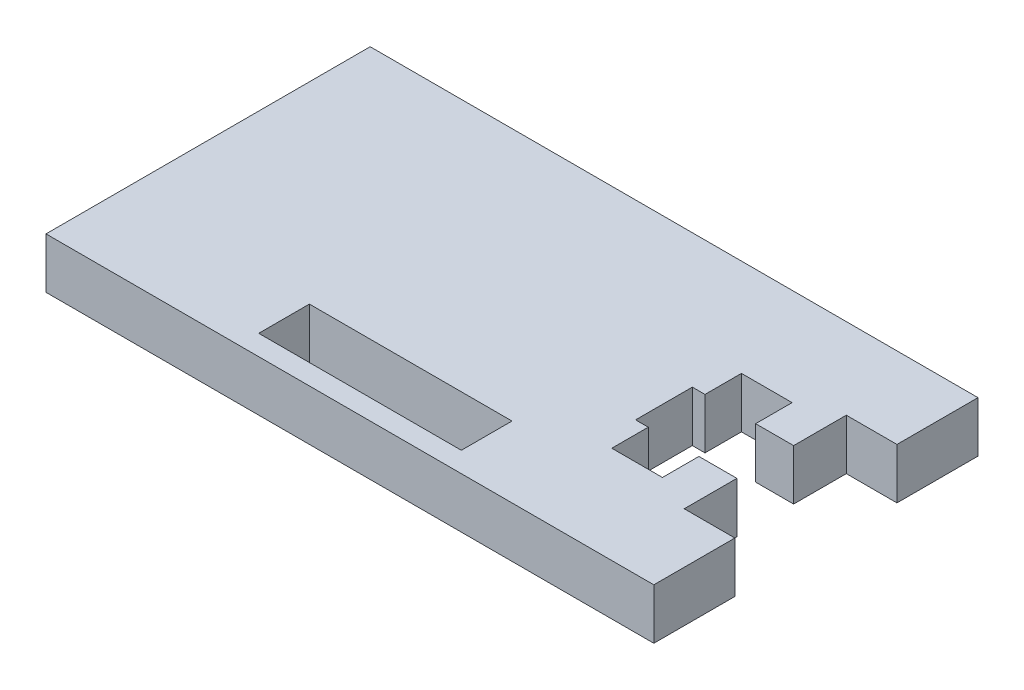
ISO-10303-21;
HEADER;
FILE_DESCRIPTION(('STEP AP214'),'2;1');
FILE_NAME('part.step','',(''),(''),'','','');
FILE_SCHEMA(('AUTOMOTIVE_DESIGN { 1 0 10303 214 1 1 1 1 }'));
ENDSEC;
DATA;
#1=APPLICATION_CONTEXT('core data for automotive mechanical design processes');
#2=APPLICATION_PROTOCOL_DEFINITION('international standard','automotive_design',2000,#1);
#3=PRODUCT_CONTEXT('',#1,'mechanical');
#4=PRODUCT('Part','Part','',(#3));
#5=PRODUCT_RELATED_PRODUCT_CATEGORY('part','',(#4));
#6=PRODUCT_DEFINITION_FORMATION('','',#4);
#7=PRODUCT_DEFINITION_CONTEXT('part definition',#1,'design');
#8=PRODUCT_DEFINITION('design','',#6,#7);
#9=PRODUCT_DEFINITION_SHAPE('','',#8);
#10=(LENGTH_UNIT() NAMED_UNIT(*) SI_UNIT(.MILLI.,.METRE.));
#11=(NAMED_UNIT(*) PLANE_ANGLE_UNIT() SI_UNIT($,.RADIAN.));
#12=(NAMED_UNIT(*) SI_UNIT($,.STERADIAN.) SOLID_ANGLE_UNIT());
#13=UNCERTAINTY_MEASURE_WITH_UNIT(LENGTH_MEASURE(1.E-05),#10,'distance_accuracy_value','');
#14=(GEOMETRIC_REPRESENTATION_CONTEXT(3) GLOBAL_UNCERTAINTY_ASSIGNED_CONTEXT((#13)) GLOBAL_UNIT_ASSIGNED_CONTEXT((#10,
#11,#12)) REPRESENTATION_CONTEXT('',''));
#15=CARTESIAN_POINT('',(0.,0.,0.));
#16=DIRECTION('',(0.,0.,1.));
#17=DIRECTION('',(1.,0.,0.));
#18=AXIS2_PLACEMENT_3D('',#15,#16,#17);
#19=CARTESIAN_POINT('',(0.,0.,8.38200000000001));
#20=DIRECTION('',(0.,0.,-1.));
#21=DIRECTION('',(-1.,0.,0.));
#22=AXIS2_PLACEMENT_3D('',#19,#20,#21);
#23=PLANE('',#22);
#24=DIRECTION('',(-1.,0.,0.));
#25=VECTOR('',#24,1.);
#26=CARTESIAN_POINT('',(0.,0.,8.38200000000001));
#27=LINE('',#26,#25);
#28=CARTESIAN_POINT('',(29.36875,0.,8.382));
#29=VERTEX_POINT('',#28);
#30=CARTESIAN_POINT('',(28.575,0.,8.382));
#31=VERTEX_POINT('',#30);
#32=EDGE_CURVE('E280',#29,#31,#27,.T.);
#33=ORIENTED_EDGE('',*,*,#32,.F.);
#34=DIRECTION('',(0.,1.,0.));
#35=VECTOR('',#34,1.);
#36=CARTESIAN_POINT('',(29.36875,0.,8.382));
#37=LINE('',#36,#35);
#38=CARTESIAN_POINT('',(29.36875,3.175,8.382));
#39=VERTEX_POINT('',#38);
#40=EDGE_CURVE('E272',#29,#39,#37,.T.);
#41=ORIENTED_EDGE('',*,*,#40,.T.);
#42=DIRECTION('',(-1.,0.,0.));
#43=VECTOR('',#42,1.);
#44=CARTESIAN_POINT('',(0.,3.175,8.38200000000001));
#45=LINE('',#44,#43);
#46=CARTESIAN_POINT('',(28.575,3.175,8.382));
#47=VERTEX_POINT('',#46);
#48=EDGE_CURVE('E275',#39,#47,#45,.T.);
#49=ORIENTED_EDGE('',*,*,#48,.T.);
#50=DIRECTION('',(0.,1.,0.));
#51=VECTOR('',#50,1.);
#52=CARTESIAN_POINT('',(28.575,0.,8.382));
#53=LINE('',#52,#51);
#54=EDGE_CURVE('E333',#31,#47,#53,.T.);
#55=ORIENTED_EDGE('',*,*,#54,.F.);
#56=EDGE_LOOP('',(#33,#41,#49,#55));
#57=FACE_BOUND('',#56,.T.);
#58=ADVANCED_FACE('F37',(#57),#23,.F.);
#59=CARTESIAN_POINT('',(0.,0.,11.938));
#60=DIRECTION('',(0.,0.,-1.));
#61=DIRECTION('',(-1.,0.,0.));
#62=AXIS2_PLACEMENT_3D('',#59,#60,#61);
#63=PLANE('',#62);
#64=DIRECTION('',(0.,1.,0.));
#65=VECTOR('',#64,1.);
#66=CARTESIAN_POINT('',(29.36875,0.,11.938));
#67=LINE('',#66,#65);
#68=CARTESIAN_POINT('',(29.36875,0.,11.938));
#69=VERTEX_POINT('',#68);
#70=CARTESIAN_POINT('',(29.36875,3.175,11.938));
#71=VERTEX_POINT('',#70);
#72=EDGE_CURVE('E11',#69,#71,#67,.T.);
#73=ORIENTED_EDGE('',*,*,#72,.F.);
#74=DIRECTION('',(-1.,0.,0.));
#75=VECTOR('',#74,1.);
#76=CARTESIAN_POINT('',(0.,0.,11.938));
#77=LINE('',#76,#75);
#78=CARTESIAN_POINT('',(28.575,0.,11.938));
#79=VERTEX_POINT('',#78);
#80=EDGE_CURVE('E283',#69,#79,#77,.T.);
#81=ORIENTED_EDGE('',*,*,#80,.T.);
#82=DIRECTION('',(0.,1.,0.));
#83=VECTOR('',#82,1.);
#84=CARTESIAN_POINT('',(28.575,0.,11.938));
#85=LINE('',#84,#83);
#86=CARTESIAN_POINT('',(28.575,3.175,11.938));
#87=VERTEX_POINT('',#86);
#88=EDGE_CURVE('E330',#79,#87,#85,.T.);
#89=ORIENTED_EDGE('',*,*,#88,.T.);
#90=DIRECTION('',(-1.,0.,0.));
#91=VECTOR('',#90,1.);
#92=CARTESIAN_POINT('',(0.,3.175,11.938));
#93=LINE('',#92,#91);
#94=EDGE_CURVE('E302',#71,#87,#93,.T.);
#95=ORIENTED_EDGE('',*,*,#94,.F.);
#96=EDGE_LOOP('',(#73,#81,#89,#95));
#97=FACE_BOUND('',#96,.T.);
#98=ADVANCED_FACE('F445',(#97),#63,.T.);
#99=CARTESIAN_POINT('',(38.1,3.175,0.));
#100=DIRECTION('',(-1.,0.,0.));
#101=DIRECTION('',(0.,0.,1.));
#102=AXIS2_PLACEMENT_3D('',#99,#100,#101);
#103=PLANE('',#102);
#104=DIRECTION('',(0.,1.,0.));
#105=VECTOR('',#104,1.);
#106=CARTESIAN_POINT('',(38.1,0.,15.24));
#107=LINE('',#106,#105);
#108=CARTESIAN_POINT('',(38.1,0.,15.24));
#109=VERTEX_POINT('',#108);
#110=CARTESIAN_POINT('',(38.1,3.175,15.24));
#111=VERTEX_POINT('',#110);
#112=EDGE_CURVE('E323',#109,#111,#107,.T.);
#113=ORIENTED_EDGE('',*,*,#112,.T.);
#114=DIRECTION('',(0.,0.,-1.));
#115=VECTOR('',#114,1.);
#116=CARTESIAN_POINT('',(38.1,3.175,0.));
#117=LINE('',#116,#115);
#118=CARTESIAN_POINT('',(38.1,3.175,20.32));
#119=VERTEX_POINT('',#118);
#120=EDGE_CURVE('E343',#119,#111,#117,.T.);
#121=ORIENTED_EDGE('',*,*,#120,.F.);
#122=DIRECTION('',(0.,-1.,0.));
#123=VECTOR('',#122,1.);
#124=CARTESIAN_POINT('',(38.1,3.175,20.32));
#125=LINE('',#124,#123);
#126=CARTESIAN_POINT('',(38.1,0.,20.32));
#127=VERTEX_POINT('',#126);
#128=EDGE_CURVE('E363',#119,#127,#125,.T.);
#129=ORIENTED_EDGE('',*,*,#128,.T.);
#130=DIRECTION('',(0.,0.,-1.));
#131=VECTOR('',#130,1.);
#132=CARTESIAN_POINT('',(38.1,0.,0.));
#133=LINE('',#132,#131);
#134=EDGE_CURVE('E354',#127,#109,#133,.T.);
#135=ORIENTED_EDGE('',*,*,#134,.T.);
#136=EDGE_LOOP('',(#113,#121,#129,#135));
#137=FACE_BOUND('',#136,.T.);
#138=ADVANCED_FACE('F388',(#137),#103,.F.);
#139=CARTESIAN_POINT('',(0.,3.175,0.));
#140=DIRECTION('',(1.,0.,0.));
#141=DIRECTION('',(0.,0.,-1.));
#142=AXIS2_PLACEMENT_3D('',#139,#140,#141);
#143=PLANE('',#142);
#144=DIRECTION('',(0.,0.,1.));
#145=VECTOR('',#144,1.);
#146=CARTESIAN_POINT('',(0.,0.,0.));
#147=LINE('',#146,#145);
#148=CARTESIAN_POINT('',(0.,0.,0.));
#149=VERTEX_POINT('',#148);
#150=CARTESIAN_POINT('',(0.,0.,20.32));
#151=VERTEX_POINT('',#150);
#152=EDGE_CURVE('E318',#149,#151,#147,.T.);
#153=ORIENTED_EDGE('',*,*,#152,.T.);
#154=DIRECTION('',(0.,-1.,0.));
#155=VECTOR('',#154,1.);
#156=CARTESIAN_POINT('',(0.,3.175,20.32));
#157=LINE('',#156,#155);
#158=CARTESIAN_POINT('',(0.,3.175,20.32));
#159=VERTEX_POINT('',#158);
#160=EDGE_CURVE('E366',#159,#151,#157,.T.);
#161=ORIENTED_EDGE('',*,*,#160,.F.);
#162=DIRECTION('',(0.,0.,1.));
#163=VECTOR('',#162,1.);
#164=CARTESIAN_POINT('',(0.,3.175,0.));
#165=LINE('',#164,#163);
#166=CARTESIAN_POINT('',(0.,3.175,0.));
#167=VERTEX_POINT('',#166);
#168=EDGE_CURVE('E336',#167,#159,#165,.T.);
#169=ORIENTED_EDGE('',*,*,#168,.F.);
#170=DIRECTION('',(0.,-1.,0.));
#171=VECTOR('',#170,1.);
#172=CARTESIAN_POINT('',(0.,3.175,0.));
#173=LINE('',#172,#171);
#174=EDGE_CURVE('E348',#167,#149,#173,.T.);
#175=ORIENTED_EDGE('',*,*,#174,.T.);
#176=EDGE_LOOP('',(#153,#161,#169,#175));
#177=FACE_BOUND('',#176,.T.);
#178=ADVANCED_FACE('F39',(#177),#143,.F.);
#179=CARTESIAN_POINT('',(0.,3.175,20.32));
#180=DIRECTION('',(0.,0.,-1.));
#181=DIRECTION('',(-1.,0.,0.));
#182=AXIS2_PLACEMENT_3D('',#179,#180,#181);
#183=PLANE('',#182);
#184=DIRECTION('',(1.,0.,0.));
#185=VECTOR('',#184,1.);
#186=CARTESIAN_POINT('',(0.,0.,20.32));
#187=LINE('',#186,#185);
#188=EDGE_CURVE('E351',#151,#127,#187,.T.);
#189=ORIENTED_EDGE('',*,*,#188,.T.);
#190=ORIENTED_EDGE('',*,*,#128,.F.);
#191=DIRECTION('',(1.,0.,0.));
#192=VECTOR('',#191,1.);
#193=CARTESIAN_POINT('',(0.,3.175,20.32));
#194=LINE('',#193,#192);
#195=EDGE_CURVE('E339',#159,#119,#194,.T.);
#196=ORIENTED_EDGE('',*,*,#195,.F.);
#197=ORIENTED_EDGE('',*,*,#160,.T.);
#198=EDGE_LOOP('',(#189,#190,#196,#197));
#199=FACE_BOUND('',#198,.T.);
#200=ADVANCED_FACE('F392',(#199),#183,.F.);
#201=CARTESIAN_POINT('',(38.1,3.175,5.08));
#202=VERTEX_POINT('',#201);
#203=CARTESIAN_POINT('',(38.1,3.175,0.));
#204=VERTEX_POINT('',#203);
#205=EDGE_CURVE('E342',#202,#204,#117,.T.);
#206=ORIENTED_EDGE('',*,*,#205,.F.);
#207=DIRECTION('',(0.,1.,0.));
#208=VECTOR('',#207,1.);
#209=CARTESIAN_POINT('',(38.1,0.,5.08));
#210=LINE('',#209,#208);
#211=CARTESIAN_POINT('',(38.1,0.,5.08));
#212=VERTEX_POINT('',#211);
#213=EDGE_CURVE('E321',#212,#202,#210,.T.);
#214=ORIENTED_EDGE('',*,*,#213,.F.);
#215=CARTESIAN_POINT('',(38.1,0.,0.));
#216=VERTEX_POINT('',#215);
#217=EDGE_CURVE('E353',#212,#216,#133,.T.);
#218=ORIENTED_EDGE('',*,*,#217,.T.);
#219=DIRECTION('',(0.,-1.,0.));
#220=VECTOR('',#219,1.);
#221=CARTESIAN_POINT('',(38.1,3.175,0.));
#222=LINE('',#221,#220);
#223=EDGE_CURVE('E360',#204,#216,#222,.T.);
#224=ORIENTED_EDGE('',*,*,#223,.F.);
#225=EDGE_LOOP('',(#206,#214,#218,#224));
#226=FACE_BOUND('',#225,.T.);
#227=ADVANCED_FACE('F406',(#226),#103,.F.);
#228=CARTESIAN_POINT('',(0.,3.175,0.));
#229=DIRECTION('',(0.,0.,1.));
#230=DIRECTION('',(1.,0.,0.));
#231=AXIS2_PLACEMENT_3D('',#228,#229,#230);
#232=PLANE('',#231);
#233=DIRECTION('',(-1.,0.,0.));
#234=VECTOR('',#233,1.);
#235=CARTESIAN_POINT('',(0.,0.,0.));
#236=LINE('',#235,#234);
#237=EDGE_CURVE('E340',#216,#149,#236,.T.);
#238=ORIENTED_EDGE('',*,*,#237,.T.);
#239=ORIENTED_EDGE('',*,*,#174,.F.);
#240=DIRECTION('',(-1.,0.,0.));
#241=VECTOR('',#240,1.);
#242=CARTESIAN_POINT('',(0.,3.175,0.));
#243=LINE('',#242,#241);
#244=EDGE_CURVE('E346',#204,#167,#243,.T.);
#245=ORIENTED_EDGE('',*,*,#244,.F.);
#246=ORIENTED_EDGE('',*,*,#223,.T.);
#247=EDGE_LOOP('',(#238,#239,#245,#246));
#248=FACE_BOUND('',#247,.T.);
#249=ADVANCED_FACE('F402',(#248),#232,.F.);
#250=CARTESIAN_POINT('',(0.,3.175,0.));
#251=DIRECTION('',(0.,1.,0.));
#252=DIRECTION('',(0.,0.,1.));
#253=AXIS2_PLACEMENT_3D('',#250,#251,#252);
#254=PLANE('',#253);
#255=DIRECTION('',(0.,0.,1.));
#256=VECTOR('',#255,1.);
#257=CARTESIAN_POINT('',(12.065,3.175,15.875));
#258=LINE('',#257,#256);
#259=CARTESIAN_POINT('',(12.065,3.175,15.875));
#260=VERTEX_POINT('',#259);
#261=CARTESIAN_POINT('',(12.065,3.175,19.05));
#262=VERTEX_POINT('',#261);
#263=EDGE_CURVE('E52',#260,#262,#258,.T.);
#264=ORIENTED_EDGE('',*,*,#263,.F.);
#265=DIRECTION('',(-1.,0.,0.));
#266=VECTOR('',#265,1.);
#267=CARTESIAN_POINT('',(12.065,3.175,15.875));
#268=LINE('',#267,#266);
#269=CARTESIAN_POINT('',(24.765,3.175,15.875));
#270=VERTEX_POINT('',#269);
#271=EDGE_CURVE('E215',#270,#260,#268,.T.);
#272=ORIENTED_EDGE('',*,*,#271,.F.);
#273=DIRECTION('',(0.,0.,-1.));
#274=VECTOR('',#273,1.);
#275=CARTESIAN_POINT('',(24.765,3.175,15.875));
#276=LINE('',#275,#274);
#277=CARTESIAN_POINT('',(24.765,3.175,19.05));
#278=VERTEX_POINT('',#277);
#279=EDGE_CURVE('E218',#278,#270,#276,.T.);
#280=ORIENTED_EDGE('',*,*,#279,.F.);
#281=DIRECTION('',(1.,0.,0.));
#282=VECTOR('',#281,1.);
#283=CARTESIAN_POINT('',(12.065,3.175,19.05));
#284=LINE('',#283,#282);
#285=EDGE_CURVE('E224',#262,#278,#284,.T.);
#286=ORIENTED_EDGE('',*,*,#285,.F.);
#287=EDGE_LOOP('',(#264,#272,#280,#286));
#288=FACE_BOUND('',#287,.T.);
#289=DIRECTION('',(0.,0.,1.));
#290=VECTOR('',#289,1.);
#291=CARTESIAN_POINT('',(29.36875,3.175,14.224));
#292=LINE('',#291,#290);
#293=CARTESIAN_POINT('',(29.36875,3.175,6.096));
#294=VERTEX_POINT('',#293);
#295=EDGE_CURVE('E249',#294,#39,#292,.T.);
#296=ORIENTED_EDGE('',*,*,#295,.F.);
#297=DIRECTION('',(-1.,0.,0.));
#298=VECTOR('',#297,1.);
#299=CARTESIAN_POINT('',(29.36875,3.175,6.096));
#300=LINE('',#299,#298);
#301=CARTESIAN_POINT('',(32.54375,3.175,6.096));
#302=VERTEX_POINT('',#301);
#303=EDGE_CURVE('E257',#302,#294,#300,.T.);
#304=ORIENTED_EDGE('',*,*,#303,.F.);
#305=DIRECTION('',(0.,0.,-1.));
#306=VECTOR('',#305,1.);
#307=CARTESIAN_POINT('',(32.54375,3.175,14.224));
#308=LINE('',#307,#306);
#309=CARTESIAN_POINT('',(32.54375,3.175,8.382));
#310=VERTEX_POINT('',#309);
#311=EDGE_CURVE('E254',#310,#302,#308,.T.);
#312=ORIENTED_EDGE('',*,*,#311,.F.);
#313=CARTESIAN_POINT('',(34.925,3.175,8.382));
#314=VERTEX_POINT('',#313);
#315=EDGE_CURVE('E296',#314,#310,#45,.T.);
#316=ORIENTED_EDGE('',*,*,#315,.F.);
#317=DIRECTION('',(0.,0.,1.));
#318=VECTOR('',#317,1.);
#319=CARTESIAN_POINT('',(34.925,3.175,0.));
#320=LINE('',#319,#318);
#321=CARTESIAN_POINT('',(34.925,3.175,5.08));
#322=VERTEX_POINT('',#321);
#323=EDGE_CURVE('E310',#322,#314,#320,.T.);
#324=ORIENTED_EDGE('',*,*,#323,.F.);
#325=DIRECTION('',(-1.,0.,0.));
#326=VECTOR('',#325,1.);
#327=CARTESIAN_POINT('',(0.,3.175,5.07999999999998));
#328=LINE('',#327,#326);
#329=EDGE_CURVE('E313',#202,#322,#328,.T.);
#330=ORIENTED_EDGE('',*,*,#329,.F.);
#331=ORIENTED_EDGE('',*,*,#205,.T.);
#332=ORIENTED_EDGE('',*,*,#244,.T.);
#333=ORIENTED_EDGE('',*,*,#168,.T.);
#334=ORIENTED_EDGE('',*,*,#195,.T.);
#335=ORIENTED_EDGE('',*,*,#120,.T.);
#336=DIRECTION('',(-1.,0.,0.));
#337=VECTOR('',#336,1.);
#338=CARTESIAN_POINT('',(0.,3.175,15.24));
#339=LINE('',#338,#337);
#340=CARTESIAN_POINT('',(34.925,3.175,15.24));
#341=VERTEX_POINT('',#340);
#342=EDGE_CURVE('E309',#111,#341,#339,.T.);
#343=ORIENTED_EDGE('',*,*,#342,.T.);
#344=CARTESIAN_POINT('',(34.925,3.175,11.938));
#345=VERTEX_POINT('',#344);
#346=EDGE_CURVE('E306',#345,#341,#320,.T.);
#347=ORIENTED_EDGE('',*,*,#346,.F.);
#348=CARTESIAN_POINT('',(32.54375,3.175,11.938));
#349=VERTEX_POINT('',#348);
#350=EDGE_CURVE('E303',#345,#349,#93,.T.);
#351=ORIENTED_EDGE('',*,*,#350,.T.);
#352=CARTESIAN_POINT('',(32.54375,3.175,14.224));
#353=VERTEX_POINT('',#352);
#354=EDGE_CURVE('E255',#353,#349,#308,.T.);
#355=ORIENTED_EDGE('',*,*,#354,.F.);
#356=DIRECTION('',(1.,0.,0.));
#357=VECTOR('',#356,1.);
#358=CARTESIAN_POINT('',(29.36875,3.175,14.224));
#359=LINE('',#358,#357);
#360=CARTESIAN_POINT('',(29.36875,3.175,14.224));
#361=VERTEX_POINT('',#360);
#362=EDGE_CURVE('E251',#361,#353,#359,.T.);
#363=ORIENTED_EDGE('',*,*,#362,.F.);
#364=EDGE_CURVE('E230',#71,#361,#292,.T.);
#365=ORIENTED_EDGE('',*,*,#364,.F.);
#366=ORIENTED_EDGE('',*,*,#94,.T.);
#367=DIRECTION('',(0.,0.,1.));
#368=VECTOR('',#367,1.);
#369=CARTESIAN_POINT('',(28.575,3.175,0.));
#370=LINE('',#369,#368);
#371=EDGE_CURVE('E299',#47,#87,#370,.T.);
#372=ORIENTED_EDGE('',*,*,#371,.F.);
#373=ORIENTED_EDGE('',*,*,#48,.F.);
#374=EDGE_LOOP('',(#296,#304,#312,#316,#324,#330,#331,#332,#333,#334,#335,#343,#347,#351,#355,
#363,#365,#366,#372,#373));
#375=FACE_BOUND('',#374,.T.);
#376=ADVANCED_FACE('F452',(#288,#375),#254,.T.);
#377=CARTESIAN_POINT('',(0.,0.,0.));
#378=DIRECTION('',(0.,1.,0.));
#379=DIRECTION('',(0.,0.,1.));
#380=AXIS2_PLACEMENT_3D('',#377,#378,#379);
#381=PLANE('',#380);
#382=DIRECTION('',(-1.,0.,0.));
#383=VECTOR('',#382,1.);
#384=CARTESIAN_POINT('',(12.065,0.,15.875));
#385=LINE('',#384,#383);
#386=CARTESIAN_POINT('',(24.765,0.,15.875));
#387=VERTEX_POINT('',#386);
#388=CARTESIAN_POINT('',(12.065,0.,15.875));
#389=VERTEX_POINT('',#388);
#390=EDGE_CURVE('E205',#387,#389,#385,.T.);
#391=ORIENTED_EDGE('',*,*,#390,.T.);
#392=DIRECTION('',(0.,0.,1.));
#393=VECTOR('',#392,1.);
#394=CARTESIAN_POINT('',(12.065,0.,15.875));
#395=LINE('',#394,#393);
#396=CARTESIAN_POINT('',(12.065,0.,19.05));
#397=VERTEX_POINT('',#396);
#398=EDGE_CURVE('E199',#389,#397,#395,.T.);
#399=ORIENTED_EDGE('',*,*,#398,.T.);
#400=DIRECTION('',(1.,0.,0.));
#401=VECTOR('',#400,1.);
#402=CARTESIAN_POINT('',(12.065,0.,19.05));
#403=LINE('',#402,#401);
#404=CARTESIAN_POINT('',(24.765,0.,19.05));
#405=VERTEX_POINT('',#404);
#406=EDGE_CURVE('E208',#397,#405,#403,.T.);
#407=ORIENTED_EDGE('',*,*,#406,.T.);
#408=DIRECTION('',(0.,0.,-1.));
#409=VECTOR('',#408,1.);
#410=CARTESIAN_POINT('',(24.765,0.,15.875));
#411=LINE('',#410,#409);
#412=EDGE_CURVE('E60',#405,#387,#411,.T.);
#413=ORIENTED_EDGE('',*,*,#412,.T.);
#414=EDGE_LOOP('',(#391,#399,#407,#413));
#415=FACE_BOUND('',#414,.T.);
#416=DIRECTION('',(-1.,0.,0.));
#417=VECTOR('',#416,1.);
#418=CARTESIAN_POINT('',(29.36875,0.,6.096));
#419=LINE('',#418,#417);
#420=CARTESIAN_POINT('',(32.54375,0.,6.096));
#421=VERTEX_POINT('',#420);
#422=CARTESIAN_POINT('',(29.36875,0.,6.096));
#423=VERTEX_POINT('',#422);
#424=EDGE_CURVE('E245',#421,#423,#419,.T.);
#425=ORIENTED_EDGE('',*,*,#424,.T.);
#426=DIRECTION('',(0.,0.,1.));
#427=VECTOR('',#426,1.);
#428=CARTESIAN_POINT('',(29.36875,0.,14.224));
#429=LINE('',#428,#427);
#430=EDGE_CURVE('E234',#423,#29,#429,.T.);
#431=ORIENTED_EDGE('',*,*,#430,.T.);
#432=ORIENTED_EDGE('',*,*,#32,.T.);
#433=DIRECTION('',(0.,0.,1.));
#434=VECTOR('',#433,1.);
#435=CARTESIAN_POINT('',(28.575,0.,0.));
#436=LINE('',#435,#434);
#437=EDGE_CURVE('E279',#31,#79,#436,.T.);
#438=ORIENTED_EDGE('',*,*,#437,.T.);
#439=ORIENTED_EDGE('',*,*,#80,.F.);
#440=CARTESIAN_POINT('',(29.36875,0.,14.224));
#441=VERTEX_POINT('',#440);
#442=EDGE_CURVE('E238',#69,#441,#429,.T.);
#443=ORIENTED_EDGE('',*,*,#442,.T.);
#444=DIRECTION('',(1.,0.,0.));
#445=VECTOR('',#444,1.);
#446=CARTESIAN_POINT('',(29.36875,0.,14.224));
#447=LINE('',#446,#445);
#448=CARTESIAN_POINT('',(32.54375,0.,14.224));
#449=VERTEX_POINT('',#448);
#450=EDGE_CURVE('E237',#441,#449,#447,.T.);
#451=ORIENTED_EDGE('',*,*,#450,.T.);
#452=DIRECTION('',(0.,0.,-1.));
#453=VECTOR('',#452,1.);
#454=CARTESIAN_POINT('',(32.54375,0.,14.224));
#455=LINE('',#454,#453);
#456=CARTESIAN_POINT('',(32.54375,0.,11.938));
#457=VERTEX_POINT('',#456);
#458=EDGE_CURVE('E242',#449,#457,#455,.T.);
#459=ORIENTED_EDGE('',*,*,#458,.T.);
#460=CARTESIAN_POINT('',(34.925,0.,11.938));
#461=VERTEX_POINT('',#460);
#462=EDGE_CURVE('E284',#461,#457,#77,.T.);
#463=ORIENTED_EDGE('',*,*,#462,.F.);
#464=DIRECTION('',(0.,0.,1.));
#465=VECTOR('',#464,1.);
#466=CARTESIAN_POINT('',(34.925,0.,0.));
#467=LINE('',#466,#465);
#468=CARTESIAN_POINT('',(34.925,0.,15.24));
#469=VERTEX_POINT('',#468);
#470=EDGE_CURVE('E287',#461,#469,#467,.T.);
#471=ORIENTED_EDGE('',*,*,#470,.T.);
#472=DIRECTION('',(-1.,0.,0.));
#473=VECTOR('',#472,1.);
#474=CARTESIAN_POINT('',(0.,0.,15.24));
#475=LINE('',#474,#473);
#476=EDGE_CURVE('E290',#109,#469,#475,.T.);
#477=ORIENTED_EDGE('',*,*,#476,.F.);
#478=ORIENTED_EDGE('',*,*,#134,.F.);
#479=ORIENTED_EDGE('',*,*,#188,.F.);
#480=ORIENTED_EDGE('',*,*,#152,.F.);
#481=ORIENTED_EDGE('',*,*,#237,.F.);
#482=ORIENTED_EDGE('',*,*,#217,.F.);
#483=DIRECTION('',(-1.,0.,0.));
#484=VECTOR('',#483,1.);
#485=CARTESIAN_POINT('',(0.,0.,5.07999999999998));
#486=LINE('',#485,#484);
#487=CARTESIAN_POINT('',(34.925,0.,5.08));
#488=VERTEX_POINT('',#487);
#489=EDGE_CURVE('E293',#212,#488,#486,.T.);
#490=ORIENTED_EDGE('',*,*,#489,.T.);
#491=CARTESIAN_POINT('',(34.925,0.,8.382));
#492=VERTEX_POINT('',#491);
#493=EDGE_CURVE('E291',#488,#492,#467,.T.);
#494=ORIENTED_EDGE('',*,*,#493,.T.);
#495=CARTESIAN_POINT('',(32.54375,0.,8.382));
#496=VERTEX_POINT('',#495);
#497=EDGE_CURVE('E276',#492,#496,#27,.T.);
#498=ORIENTED_EDGE('',*,*,#497,.T.);
#499=EDGE_CURVE('E241',#496,#421,#455,.T.);
#500=ORIENTED_EDGE('',*,*,#499,.T.);
#501=EDGE_LOOP('',(#425,#431,#432,#438,#439,#443,#451,#459,#463,#471,#477,#478,#479,#480,#481,
#482,#490,#494,#498,#500));
#502=FACE_BOUND('',#501,.T.);
#503=ADVANCED_FACE('F212',(#415,#502),#381,.F.);
#504=ORIENTED_EDGE('',*,*,#315,.T.);
#505=DIRECTION('',(0.,-1.,0.));
#506=VECTOR('',#505,1.);
#507=CARTESIAN_POINT('',(32.54375,0.,8.382));
#508=LINE('',#507,#506);
#509=EDGE_CURVE('E262',#310,#496,#508,.T.);
#510=ORIENTED_EDGE('',*,*,#509,.T.);
#511=ORIENTED_EDGE('',*,*,#497,.F.);
#512=DIRECTION('',(0.,1.,0.));
#513=VECTOR('',#512,1.);
#514=CARTESIAN_POINT('',(34.925,0.,8.382));
#515=LINE('',#514,#513);
#516=EDGE_CURVE('E316',#492,#314,#515,.T.);
#517=ORIENTED_EDGE('',*,*,#516,.T.);
#518=EDGE_LOOP('',(#504,#510,#511,#517));
#519=FACE_BOUND('',#518,.T.);
#520=ADVANCED_FACE('F420',(#519),#23,.F.);
#521=CARTESIAN_POINT('',(34.925,0.,0.));
#522=DIRECTION('',(-1.,0.,0.));
#523=DIRECTION('',(0.,0.,1.));
#524=AXIS2_PLACEMENT_3D('',#521,#522,#523);
#525=PLANE('',#524);
#526=ORIENTED_EDGE('',*,*,#323,.T.);
#527=ORIENTED_EDGE('',*,*,#516,.F.);
#528=ORIENTED_EDGE('',*,*,#493,.F.);
#529=DIRECTION('',(0.,1.,0.));
#530=VECTOR('',#529,1.);
#531=CARTESIAN_POINT('',(34.925,0.,5.08));
#532=LINE('',#531,#530);
#533=EDGE_CURVE('E319',#488,#322,#532,.T.);
#534=ORIENTED_EDGE('',*,*,#533,.T.);
#535=EDGE_LOOP('',(#526,#527,#528,#534));
#536=FACE_BOUND('',#535,.T.);
#537=ADVANCED_FACE('F416',(#536),#525,.F.);
#538=CARTESIAN_POINT('',(0.,0.,5.07999999999998));
#539=DIRECTION('',(0.,0.,-1.));
#540=DIRECTION('',(-1.,0.,0.));
#541=AXIS2_PLACEMENT_3D('',#538,#539,#540);
#542=PLANE('',#541);
#543=ORIENTED_EDGE('',*,*,#329,.T.);
#544=ORIENTED_EDGE('',*,*,#533,.F.);
#545=ORIENTED_EDGE('',*,*,#489,.F.);
#546=ORIENTED_EDGE('',*,*,#213,.T.);
#547=EDGE_LOOP('',(#543,#544,#545,#546));
#548=FACE_BOUND('',#547,.T.);
#549=ADVANCED_FACE('F411',(#548),#542,.F.);
#550=CARTESIAN_POINT('',(0.,0.,15.24));
#551=DIRECTION('',(0.,0.,-1.));
#552=DIRECTION('',(-1.,0.,0.));
#553=AXIS2_PLACEMENT_3D('',#550,#551,#552);
#554=PLANE('',#553);
#555=ORIENTED_EDGE('',*,*,#342,.F.);
#556=ORIENTED_EDGE('',*,*,#112,.F.);
#557=ORIENTED_EDGE('',*,*,#476,.T.);
#558=DIRECTION('',(0.,1.,0.));
#559=VECTOR('',#558,1.);
#560=CARTESIAN_POINT('',(34.925,0.,15.24));
#561=LINE('',#560,#559);
#562=EDGE_CURVE('E326',#469,#341,#561,.T.);
#563=ORIENTED_EDGE('',*,*,#562,.T.);
#564=EDGE_LOOP('',(#555,#556,#557,#563));
#565=FACE_BOUND('',#564,.T.);
#566=ADVANCED_FACE('F604',(#565),#554,.T.);
#567=ORIENTED_EDGE('',*,*,#346,.T.);
#568=ORIENTED_EDGE('',*,*,#562,.F.);
#569=ORIENTED_EDGE('',*,*,#470,.F.);
#570=DIRECTION('',(0.,1.,0.));
#571=VECTOR('',#570,1.);
#572=CARTESIAN_POINT('',(34.925,0.,11.938));
#573=LINE('',#572,#571);
#574=EDGE_CURVE('E328',#461,#345,#573,.T.);
#575=ORIENTED_EDGE('',*,*,#574,.T.);
#576=EDGE_LOOP('',(#567,#568,#569,#575));
#577=FACE_BOUND('',#576,.T.);
#578=ADVANCED_FACE('F383',(#577),#525,.F.);
#579=DIRECTION('',(0.,-1.,0.));
#580=VECTOR('',#579,1.);
#581=CARTESIAN_POINT('',(32.54375,0.,11.938));
#582=LINE('',#581,#580);
#583=EDGE_CURVE('E45',#349,#457,#582,.T.);
#584=ORIENTED_EDGE('',*,*,#583,.F.);
#585=ORIENTED_EDGE('',*,*,#350,.F.);
#586=ORIENTED_EDGE('',*,*,#574,.F.);
#587=ORIENTED_EDGE('',*,*,#462,.T.);
#588=EDGE_LOOP('',(#584,#585,#586,#587));
#589=FACE_BOUND('',#588,.T.);
#590=ADVANCED_FACE('F378',(#589),#63,.T.);
#591=CARTESIAN_POINT('',(28.575,0.,0.));
#592=DIRECTION('',(-1.,0.,0.));
#593=DIRECTION('',(0.,0.,1.));
#594=AXIS2_PLACEMENT_3D('',#591,#592,#593);
#595=PLANE('',#594);
#596=ORIENTED_EDGE('',*,*,#371,.T.);
#597=ORIENTED_EDGE('',*,*,#88,.F.);
#598=ORIENTED_EDGE('',*,*,#437,.F.);
#599=ORIENTED_EDGE('',*,*,#54,.T.);
#600=EDGE_LOOP('',(#596,#597,#598,#599));
#601=FACE_BOUND('',#600,.T.);
#602=ADVANCED_FACE('F441',(#601),#595,.F.);
#603=CARTESIAN_POINT('',(32.54375,0.,14.224));
#604=DIRECTION('',(1.,0.,0.));
#605=DIRECTION('',(0.,0.,-1.));
#606=AXIS2_PLACEMENT_3D('',#603,#604,#605);
#607=PLANE('',#606);
#608=ORIENTED_EDGE('',*,*,#583,.T.);
#609=ORIENTED_EDGE('',*,*,#458,.F.);
#610=DIRECTION('',(0.,1.,0.));
#611=VECTOR('',#610,1.);
#612=CARTESIAN_POINT('',(32.54375,0.,14.224));
#613=LINE('',#612,#611);
#614=EDGE_CURVE('E266',#449,#353,#613,.T.);
#615=ORIENTED_EDGE('',*,*,#614,.T.);
#616=ORIENTED_EDGE('',*,*,#354,.T.);
#617=EDGE_LOOP('',(#608,#609,#615,#616));
#618=FACE_BOUND('',#617,.T.);
#619=ADVANCED_FACE('F371',(#618),#607,.F.);
#620=CARTESIAN_POINT('',(29.36875,0.,14.224));
#621=DIRECTION('',(-1.,0.,0.));
#622=DIRECTION('',(0.,0.,1.));
#623=AXIS2_PLACEMENT_3D('',#620,#621,#622);
#624=PLANE('',#623);
#625=ORIENTED_EDGE('',*,*,#72,.T.);
#626=ORIENTED_EDGE('',*,*,#364,.T.);
#627=DIRECTION('',(0.,1.,0.));
#628=VECTOR('',#627,1.);
#629=CARTESIAN_POINT('',(29.36875,0.,14.224));
#630=LINE('',#629,#628);
#631=EDGE_CURVE('E248',#441,#361,#630,.T.);
#632=ORIENTED_EDGE('',*,*,#631,.F.);
#633=ORIENTED_EDGE('',*,*,#442,.F.);
#634=EDGE_LOOP('',(#625,#626,#632,#633));
#635=FACE_BOUND('',#634,.T.);
#636=ADVANCED_FACE('F449',(#635),#624,.F.);
#637=CARTESIAN_POINT('',(29.36875,0.,14.224));
#638=DIRECTION('',(0.,0.,1.));
#639=DIRECTION('',(1.,0.,0.));
#640=AXIS2_PLACEMENT_3D('',#637,#638,#639);
#641=PLANE('',#640);
#642=ORIENTED_EDGE('',*,*,#362,.T.);
#643=ORIENTED_EDGE('',*,*,#614,.F.);
#644=ORIENTED_EDGE('',*,*,#450,.F.);
#645=ORIENTED_EDGE('',*,*,#631,.T.);
#646=EDGE_LOOP('',(#642,#643,#644,#645));
#647=FACE_BOUND('',#646,.T.);
#648=ADVANCED_FACE('F454',(#647),#641,.F.);
#649=ORIENTED_EDGE('',*,*,#430,.F.);
#650=DIRECTION('',(0.,1.,0.));
#651=VECTOR('',#650,1.);
#652=CARTESIAN_POINT('',(29.36875,0.,6.096));
#653=LINE('',#652,#651);
#654=EDGE_CURVE('E260',#423,#294,#653,.T.);
#655=ORIENTED_EDGE('',*,*,#654,.T.);
#656=ORIENTED_EDGE('',*,*,#295,.T.);
#657=ORIENTED_EDGE('',*,*,#40,.F.);
#658=EDGE_LOOP('',(#649,#655,#656,#657));
#659=FACE_BOUND('',#658,.T.);
#660=ADVANCED_FACE('F432',(#659),#624,.F.);
#661=ORIENTED_EDGE('',*,*,#311,.T.);
#662=DIRECTION('',(0.,1.,0.));
#663=VECTOR('',#662,1.);
#664=CARTESIAN_POINT('',(32.54375,0.,6.096));
#665=LINE('',#664,#663);
#666=EDGE_CURVE('E263',#421,#302,#665,.T.);
#667=ORIENTED_EDGE('',*,*,#666,.F.);
#668=ORIENTED_EDGE('',*,*,#499,.F.);
#669=ORIENTED_EDGE('',*,*,#509,.F.);
#670=EDGE_LOOP('',(#661,#667,#668,#669));
#671=FACE_BOUND('',#670,.T.);
#672=ADVANCED_FACE('F424',(#671),#607,.F.);
#673=CARTESIAN_POINT('',(29.36875,0.,6.096));
#674=DIRECTION('',(0.,0.,-1.));
#675=DIRECTION('',(-1.,0.,0.));
#676=AXIS2_PLACEMENT_3D('',#673,#674,#675);
#677=PLANE('',#676);
#678=ORIENTED_EDGE('',*,*,#303,.T.);
#679=ORIENTED_EDGE('',*,*,#654,.F.);
#680=ORIENTED_EDGE('',*,*,#424,.F.);
#681=ORIENTED_EDGE('',*,*,#666,.T.);
#682=EDGE_LOOP('',(#678,#679,#680,#681));
#683=FACE_BOUND('',#682,.T.);
#684=ADVANCED_FACE('F428',(#683),#677,.F.);
#685=CARTESIAN_POINT('',(12.065,0.,15.875));
#686=DIRECTION('',(-1.,0.,0.));
#687=DIRECTION('',(0.,0.,1.));
#688=AXIS2_PLACEMENT_3D('',#685,#686,#687);
#689=PLANE('',#688);
#690=ORIENTED_EDGE('',*,*,#263,.T.);
#691=DIRECTION('',(0.,1.,0.));
#692=VECTOR('',#691,1.);
#693=CARTESIAN_POINT('',(12.065,0.,19.05));
#694=LINE('',#693,#692);
#695=EDGE_CURVE('E195',#397,#262,#694,.T.);
#696=ORIENTED_EDGE('',*,*,#695,.F.);
#697=ORIENTED_EDGE('',*,*,#398,.F.);
#698=DIRECTION('',(0.,1.,0.));
#699=VECTOR('',#698,1.);
#700=CARTESIAN_POINT('',(12.065,0.,15.875));
#701=LINE('',#700,#699);
#702=EDGE_CURVE('E228',#389,#260,#701,.T.);
#703=ORIENTED_EDGE('',*,*,#702,.T.);
#704=EDGE_LOOP('',(#690,#696,#697,#703));
#705=FACE_BOUND('',#704,.T.);
#706=ADVANCED_FACE('F197',(#705),#689,.F.);
#707=CARTESIAN_POINT('',(12.065,0.,15.875));
#708=DIRECTION('',(0.,0.,-1.));
#709=DIRECTION('',(-1.,0.,0.));
#710=AXIS2_PLACEMENT_3D('',#707,#708,#709);
#711=PLANE('',#710);
#712=ORIENTED_EDGE('',*,*,#271,.T.);
#713=ORIENTED_EDGE('',*,*,#702,.F.);
#714=ORIENTED_EDGE('',*,*,#390,.F.);
#715=DIRECTION('',(0.,1.,0.));
#716=VECTOR('',#715,1.);
#717=CARTESIAN_POINT('',(24.765,0.,15.875));
#718=LINE('',#717,#716);
#719=EDGE_CURVE('E231',#387,#270,#718,.T.);
#720=ORIENTED_EDGE('',*,*,#719,.T.);
#721=EDGE_LOOP('',(#712,#713,#714,#720));
#722=FACE_BOUND('',#721,.T.);
#723=ADVANCED_FACE('F534',(#722),#711,.F.);
#724=CARTESIAN_POINT('',(24.765,0.,15.875));
#725=DIRECTION('',(1.,0.,0.));
#726=DIRECTION('',(0.,0.,-1.));
#727=AXIS2_PLACEMENT_3D('',#724,#725,#726);
#728=PLANE('',#727);
#729=ORIENTED_EDGE('',*,*,#279,.T.);
#730=ORIENTED_EDGE('',*,*,#719,.F.);
#731=ORIENTED_EDGE('',*,*,#412,.F.);
#732=DIRECTION('',(0.,1.,0.));
#733=VECTOR('',#732,1.);
#734=CARTESIAN_POINT('',(24.765,0.,19.05));
#735=LINE('',#734,#733);
#736=EDGE_CURVE('E204',#405,#278,#735,.T.);
#737=ORIENTED_EDGE('',*,*,#736,.T.);
#738=EDGE_LOOP('',(#729,#730,#731,#737));
#739=FACE_BOUND('',#738,.T.);
#740=ADVANCED_FACE('F539',(#739),#728,.F.);
#741=CARTESIAN_POINT('',(12.065,0.,19.05));
#742=DIRECTION('',(0.,0.,1.));
#743=DIRECTION('',(1.,0.,0.));
#744=AXIS2_PLACEMENT_3D('',#741,#742,#743);
#745=PLANE('',#744);
#746=ORIENTED_EDGE('',*,*,#285,.T.);
#747=ORIENTED_EDGE('',*,*,#736,.F.);
#748=ORIENTED_EDGE('',*,*,#406,.F.);
#749=ORIENTED_EDGE('',*,*,#695,.T.);
#750=EDGE_LOOP('',(#746,#747,#748,#749));
#751=FACE_BOUND('',#750,.T.);
#752=ADVANCED_FACE('F209',(#751),#745,.F.);
#753=CLOSED_SHELL('',(#58,#98,#138,#178,#200,#227,#249,#376,#503,#520,#537,#549,#566,#578,#590,
#602,#619,#636,#648,#660,#672,#684,#706,#723,#740,#752));
#754=MANIFOLD_SOLID_BREP('B2',#753);
#755=ADVANCED_BREP_SHAPE_REPRESENTATION('',(#18,#754),#14);
#756=SHAPE_DEFINITION_REPRESENTATION(#9,#755);
ENDSEC;
END-ISO-10303-21;
